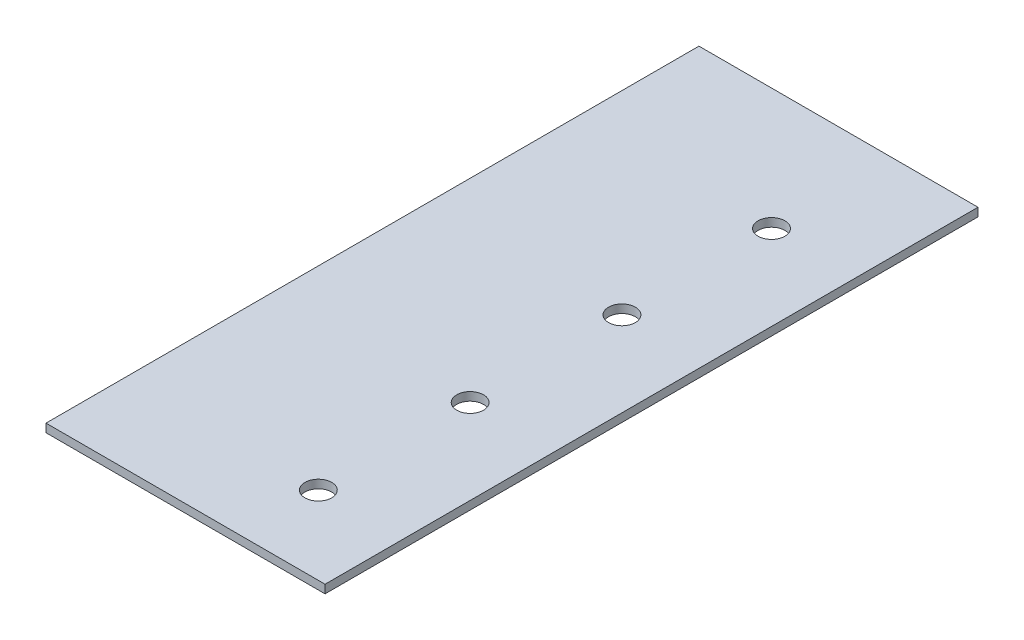
ISO-10303-21;
HEADER;
FILE_DESCRIPTION(('STEP AP214'),'2;1');
FILE_NAME('part.step','',(''),(''),'','','');
FILE_SCHEMA(('AUTOMOTIVE_DESIGN { 1 0 10303 214 1 1 1 1 }'));
ENDSEC;
DATA;
#1=APPLICATION_CONTEXT('core data for automotive mechanical design processes');
#2=APPLICATION_PROTOCOL_DEFINITION('international standard','automotive_design',2000,#1);
#3=PRODUCT_CONTEXT('',#1,'mechanical');
#4=PRODUCT('Part','Part','',(#3));
#5=PRODUCT_RELATED_PRODUCT_CATEGORY('part','',(#4));
#6=PRODUCT_DEFINITION_FORMATION('','',#4);
#7=PRODUCT_DEFINITION_CONTEXT('part definition',#1,'design');
#8=PRODUCT_DEFINITION('design','',#6,#7);
#9=PRODUCT_DEFINITION_SHAPE('','',#8);
#10=(LENGTH_UNIT() NAMED_UNIT(*) SI_UNIT(.MILLI.,.METRE.));
#11=(NAMED_UNIT(*) PLANE_ANGLE_UNIT() SI_UNIT($,.RADIAN.));
#12=(NAMED_UNIT(*) SI_UNIT($,.STERADIAN.) SOLID_ANGLE_UNIT());
#13=UNCERTAINTY_MEASURE_WITH_UNIT(LENGTH_MEASURE(1.E-05),#10,'distance_accuracy_value','');
#14=(GEOMETRIC_REPRESENTATION_CONTEXT(3) GLOBAL_UNCERTAINTY_ASSIGNED_CONTEXT((#13)) GLOBAL_UNIT_ASSIGNED_CONTEXT((#10,
#11,#12)) REPRESENTATION_CONTEXT('',''));
#15=CARTESIAN_POINT('',(0.,0.,0.));
#16=DIRECTION('',(0.,0.,1.));
#17=DIRECTION('',(1.,0.,0.));
#18=AXIS2_PLACEMENT_3D('',#15,#16,#17);
#19=CARTESIAN_POINT('',(0.,1.905,0.));
#20=DIRECTION('',(1.,0.,0.));
#21=DIRECTION('',(0.,0.,-1.));
#22=AXIS2_PLACEMENT_3D('',#19,#20,#21);
#23=PLANE('',#22);
#24=DIRECTION('',(0.,0.,1.));
#25=VECTOR('',#24,1.);
#26=CARTESIAN_POINT('',(0.,0.,0.));
#27=LINE('',#26,#25);
#28=CARTESIAN_POINT('',(0.,0.,-148.59));
#29=VERTEX_POINT('',#28);
#30=CARTESIAN_POINT('',(0.,0.,0.));
#31=VERTEX_POINT('',#30);
#32=EDGE_CURVE('E110',#29,#31,#27,.T.);
#33=ORIENTED_EDGE('',*,*,#32,.T.);
#34=DIRECTION('',(0.,-1.,0.));
#35=VECTOR('',#34,1.);
#36=CARTESIAN_POINT('',(0.,1.905,0.));
#37=LINE('',#36,#35);
#38=CARTESIAN_POINT('',(0.,1.905,0.));
#39=VERTEX_POINT('',#38);
#40=EDGE_CURVE('E11',#39,#31,#37,.T.);
#41=ORIENTED_EDGE('',*,*,#40,.F.);
#42=DIRECTION('',(0.,0.,1.));
#43=VECTOR('',#42,1.);
#44=CARTESIAN_POINT('',(0.,1.905,0.));
#45=LINE('',#44,#43);
#46=CARTESIAN_POINT('',(0.,1.905,-148.59));
#47=VERTEX_POINT('',#46);
#48=EDGE_CURVE('E94',#47,#39,#45,.T.);
#49=ORIENTED_EDGE('',*,*,#48,.F.);
#50=DIRECTION('',(0.,-1.,0.));
#51=VECTOR('',#50,1.);
#52=CARTESIAN_POINT('',(0.,1.905,-148.59));
#53=LINE('',#52,#51);
#54=EDGE_CURVE('E106',#47,#29,#53,.T.);
#55=ORIENTED_EDGE('',*,*,#54,.T.);
#56=EDGE_LOOP('',(#33,#41,#49,#55));
#57=FACE_BOUND('',#56,.T.);
#58=ADVANCED_FACE('F42',(#57),#23,.F.);
#59=CARTESIAN_POINT('',(0.,1.905,0.));
#60=DIRECTION('',(0.,0.,-1.));
#61=DIRECTION('',(-1.,0.,0.));
#62=AXIS2_PLACEMENT_3D('',#59,#60,#61);
#63=PLANE('',#62);
#64=DIRECTION('',(1.,0.,0.));
#65=VECTOR('',#64,1.);
#66=CARTESIAN_POINT('',(0.,0.,0.));
#67=LINE('',#66,#65);
#68=CARTESIAN_POINT('',(63.5,0.,0.));
#69=VERTEX_POINT('',#68);
#70=EDGE_CURVE('E99',#31,#69,#67,.T.);
#71=ORIENTED_EDGE('',*,*,#70,.T.);
#72=DIRECTION('',(0.,-1.,0.));
#73=VECTOR('',#72,1.);
#74=CARTESIAN_POINT('',(63.5,1.905,0.));
#75=LINE('',#74,#73);
#76=CARTESIAN_POINT('',(63.5,1.905,0.));
#77=VERTEX_POINT('',#76);
#78=EDGE_CURVE('E51',#77,#69,#75,.T.);
#79=ORIENTED_EDGE('',*,*,#78,.F.);
#80=DIRECTION('',(1.,0.,0.));
#81=VECTOR('',#80,1.);
#82=CARTESIAN_POINT('',(0.,1.905,0.));
#83=LINE('',#82,#81);
#84=EDGE_CURVE('E89',#39,#77,#83,.T.);
#85=ORIENTED_EDGE('',*,*,#84,.F.);
#86=ORIENTED_EDGE('',*,*,#40,.T.);
#87=EDGE_LOOP('',(#71,#79,#85,#86));
#88=FACE_BOUND('',#87,.T.);
#89=ADVANCED_FACE('F98',(#88),#63,.F.);
#90=CARTESIAN_POINT('',(63.5,1.905,0.));
#91=DIRECTION('',(-1.,0.,0.));
#92=DIRECTION('',(0.,0.,1.));
#93=AXIS2_PLACEMENT_3D('',#90,#91,#92);
#94=PLANE('',#93);
#95=DIRECTION('',(0.,0.,-1.));
#96=VECTOR('',#95,1.);
#97=CARTESIAN_POINT('',(63.5,0.,0.));
#98=LINE('',#97,#96);
#99=CARTESIAN_POINT('',(63.5,0.,-148.59));
#100=VERTEX_POINT('',#99);
#101=EDGE_CURVE('E76',#69,#100,#98,.T.);
#102=ORIENTED_EDGE('',*,*,#101,.T.);
#103=DIRECTION('',(0.,-1.,0.));
#104=VECTOR('',#103,1.);
#105=CARTESIAN_POINT('',(63.5,1.905,-148.59));
#106=LINE('',#105,#104);
#107=CARTESIAN_POINT('',(63.5,1.905,-148.59));
#108=VERTEX_POINT('',#107);
#109=EDGE_CURVE('E101',#108,#100,#106,.T.);
#110=ORIENTED_EDGE('',*,*,#109,.F.);
#111=DIRECTION('',(0.,0.,-1.));
#112=VECTOR('',#111,1.);
#113=CARTESIAN_POINT('',(63.5,1.905,0.));
#114=LINE('',#113,#112);
#115=EDGE_CURVE('E92',#77,#108,#114,.T.);
#116=ORIENTED_EDGE('',*,*,#115,.F.);
#117=ORIENTED_EDGE('',*,*,#78,.T.);
#118=EDGE_LOOP('',(#102,#110,#116,#117));
#119=FACE_BOUND('',#118,.T.);
#120=ADVANCED_FACE('F102',(#119),#94,.F.);
#121=CARTESIAN_POINT('',(0.,1.905,-148.59));
#122=DIRECTION('',(0.,0.,1.));
#123=DIRECTION('',(1.,0.,0.));
#124=AXIS2_PLACEMENT_3D('',#121,#122,#123);
#125=PLANE('',#124);
#126=DIRECTION('',(-1.,0.,0.));
#127=VECTOR('',#126,1.);
#128=CARTESIAN_POINT('',(0.,0.,-148.59));
#129=LINE('',#128,#127);
#130=EDGE_CURVE('E82',#100,#29,#129,.T.);
#131=ORIENTED_EDGE('',*,*,#130,.T.);
#132=ORIENTED_EDGE('',*,*,#54,.F.);
#133=DIRECTION('',(-1.,0.,0.));
#134=VECTOR('',#133,1.);
#135=CARTESIAN_POINT('',(0.,1.905,-148.59));
#136=LINE('',#135,#134);
#137=EDGE_CURVE('E59',#108,#47,#136,.T.);
#138=ORIENTED_EDGE('',*,*,#137,.F.);
#139=ORIENTED_EDGE('',*,*,#109,.T.);
#140=EDGE_LOOP('',(#131,#132,#138,#139));
#141=FACE_BOUND('',#140,.T.);
#142=ADVANCED_FACE('F124',(#141),#125,.F.);
#143=CARTESIAN_POINT('',(0.,1.905,0.));
#144=DIRECTION('',(0.,-1.,0.));
#145=DIRECTION('',(0.,0.,-1.));
#146=AXIS2_PLACEMENT_3D('',#143,#144,#145);
#147=PLANE('',#146);
#148=CARTESIAN_POINT('',(44.196,1.905,-120.904));
#149=DIRECTION('',(0.,-1.,0.));
#150=DIRECTION('',(0.,0.,-1.));
#151=AXIS2_PLACEMENT_3D('',#148,#149,#150);
#152=CIRCLE('',#151,3.048);
#153=CARTESIAN_POINT('',(44.196,1.905,-123.952));
#154=VERTEX_POINT('',#153);
#155=EDGE_CURVE('E114',#154,#154,#152,.T.);
#156=ORIENTED_EDGE('',*,*,#155,.T.);
#157=EDGE_LOOP('',(#156));
#158=FACE_BOUND('',#157,.T.);
#159=CARTESIAN_POINT('',(44.196,1.905,-86.868));
#160=DIRECTION('',(0.,-1.,0.));
#161=DIRECTION('',(0.,0.,-1.));
#162=AXIS2_PLACEMENT_3D('',#159,#160,#161);
#163=CIRCLE('',#162,3.048);
#164=CARTESIAN_POINT('',(44.196,1.905,-89.916));
#165=VERTEX_POINT('',#164);
#166=EDGE_CURVE('E134',#165,#165,#163,.T.);
#167=ORIENTED_EDGE('',*,*,#166,.T.);
#168=EDGE_LOOP('',(#167));
#169=FACE_BOUND('',#168,.T.);
#170=CARTESIAN_POINT('',(44.196,1.905,-52.324));
#171=DIRECTION('',(0.,-1.,0.));
#172=DIRECTION('',(0.,0.,-1.));
#173=AXIS2_PLACEMENT_3D('',#170,#171,#172);
#174=CIRCLE('',#173,3.048);
#175=CARTESIAN_POINT('',(44.196,1.905,-55.372));
#176=VERTEX_POINT('',#175);
#177=EDGE_CURVE('E138',#176,#176,#174,.T.);
#178=ORIENTED_EDGE('',*,*,#177,.T.);
#179=EDGE_LOOP('',(#178));
#180=FACE_BOUND('',#179,.T.);
#181=CARTESIAN_POINT('',(44.196,1.905,-17.78));
#182=DIRECTION('',(0.,-1.,0.));
#183=DIRECTION('',(0.,0.,-1.));
#184=AXIS2_PLACEMENT_3D('',#181,#182,#183);
#185=CIRCLE('',#184,3.048);
#186=CARTESIAN_POINT('',(44.196,1.905,-20.828));
#187=VERTEX_POINT('',#186);
#188=EDGE_CURVE('E142',#187,#187,#185,.T.);
#189=ORIENTED_EDGE('',*,*,#188,.T.);
#190=EDGE_LOOP('',(#189));
#191=FACE_BOUND('',#190,.T.);
#192=ORIENTED_EDGE('',*,*,#48,.T.);
#193=ORIENTED_EDGE('',*,*,#84,.T.);
#194=ORIENTED_EDGE('',*,*,#115,.T.);
#195=ORIENTED_EDGE('',*,*,#137,.T.);
#196=EDGE_LOOP('',(#192,#193,#194,#195));
#197=FACE_BOUND('',#196,.T.);
#198=ADVANCED_FACE('F90',(#158,#169,#180,#191,#197),#147,.F.);
#199=CARTESIAN_POINT('',(0.,0.,0.));
#200=DIRECTION('',(0.,-1.,0.));
#201=DIRECTION('',(0.,0.,-1.));
#202=AXIS2_PLACEMENT_3D('',#199,#200,#201);
#203=PLANE('',#202);
#204=CARTESIAN_POINT('',(44.196,0.,-120.904));
#205=DIRECTION('',(0.,-1.,0.));
#206=DIRECTION('',(0.,0.,-1.));
#207=AXIS2_PLACEMENT_3D('',#204,#205,#206);
#208=CIRCLE('',#207,3.048);
#209=CARTESIAN_POINT('',(44.196,0.,-123.952));
#210=VERTEX_POINT('',#209);
#211=EDGE_CURVE('E146',#210,#210,#208,.T.);
#212=ORIENTED_EDGE('',*,*,#211,.F.);
#213=EDGE_LOOP('',(#212));
#214=FACE_BOUND('',#213,.T.);
#215=CARTESIAN_POINT('',(44.196,0.,-86.868));
#216=DIRECTION('',(0.,-1.,0.));
#217=DIRECTION('',(0.,0.,-1.));
#218=AXIS2_PLACEMENT_3D('',#215,#216,#217);
#219=CIRCLE('',#218,3.048);
#220=CARTESIAN_POINT('',(44.196,0.,-89.916));
#221=VERTEX_POINT('',#220);
#222=EDGE_CURVE('E155',#221,#221,#219,.T.);
#223=ORIENTED_EDGE('',*,*,#222,.F.);
#224=EDGE_LOOP('',(#223));
#225=FACE_BOUND('',#224,.T.);
#226=CARTESIAN_POINT('',(44.196,0.,-52.324));
#227=DIRECTION('',(0.,-1.,0.));
#228=DIRECTION('',(0.,0.,-1.));
#229=AXIS2_PLACEMENT_3D('',#226,#227,#228);
#230=CIRCLE('',#229,3.048);
#231=CARTESIAN_POINT('',(44.196,0.,-55.372));
#232=VERTEX_POINT('',#231);
#233=EDGE_CURVE('E151',#232,#232,#230,.T.);
#234=ORIENTED_EDGE('',*,*,#233,.F.);
#235=EDGE_LOOP('',(#234));
#236=FACE_BOUND('',#235,.T.);
#237=CARTESIAN_POINT('',(44.196,0.,-17.78));
#238=DIRECTION('',(0.,-1.,0.));
#239=DIRECTION('',(0.,0.,-1.));
#240=AXIS2_PLACEMENT_3D('',#237,#238,#239);
#241=CIRCLE('',#240,3.048);
#242=CARTESIAN_POINT('',(44.196,0.,-20.828));
#243=VERTEX_POINT('',#242);
#244=EDGE_CURVE('E147',#243,#243,#241,.T.);
#245=ORIENTED_EDGE('',*,*,#244,.F.);
#246=EDGE_LOOP('',(#245));
#247=FACE_BOUND('',#246,.T.);
#248=ORIENTED_EDGE('',*,*,#32,.F.);
#249=ORIENTED_EDGE('',*,*,#130,.F.);
#250=ORIENTED_EDGE('',*,*,#101,.F.);
#251=ORIENTED_EDGE('',*,*,#70,.F.);
#252=EDGE_LOOP('',(#248,#249,#250,#251));
#253=FACE_BOUND('',#252,.T.);
#254=ADVANCED_FACE('F127',(#214,#225,#236,#247,#253),#203,.T.);
#255=CARTESIAN_POINT('',(44.196,2.54,-17.78));
#256=DIRECTION('',(0.,-1.,0.));
#257=DIRECTION('',(0.,0.,-1.));
#258=AXIS2_PLACEMENT_3D('',#255,#256,#257);
#259=CYLINDRICAL_SURFACE('',#258,3.048);
#260=ORIENTED_EDGE('',*,*,#244,.T.);
#261=EDGE_LOOP('',(#260));
#262=FACE_BOUND('',#261,.T.);
#263=ORIENTED_EDGE('',*,*,#188,.F.);
#264=EDGE_LOOP('',(#263));
#265=FACE_BOUND('',#264,.T.);
#266=ADVANCED_FACE('F168',(#262,#265),#259,.F.);
#267=CARTESIAN_POINT('',(44.196,2.54,-52.324));
#268=DIRECTION('',(0.,-1.,0.));
#269=DIRECTION('',(0.,0.,-1.));
#270=AXIS2_PLACEMENT_3D('',#267,#268,#269);
#271=CYLINDRICAL_SURFACE('',#270,3.048);
#272=ORIENTED_EDGE('',*,*,#233,.T.);
#273=EDGE_LOOP('',(#272));
#274=FACE_BOUND('',#273,.T.);
#275=ORIENTED_EDGE('',*,*,#177,.F.);
#276=EDGE_LOOP('',(#275));
#277=FACE_BOUND('',#276,.T.);
#278=ADVANCED_FACE('F178',(#274,#277),#271,.F.);
#279=CARTESIAN_POINT('',(44.196,2.54,-86.868));
#280=DIRECTION('',(0.,-1.,0.));
#281=DIRECTION('',(0.,0.,-1.));
#282=AXIS2_PLACEMENT_3D('',#279,#280,#281);
#283=CYLINDRICAL_SURFACE('',#282,3.048);
#284=ORIENTED_EDGE('',*,*,#222,.T.);
#285=EDGE_LOOP('',(#284));
#286=FACE_BOUND('',#285,.T.);
#287=ORIENTED_EDGE('',*,*,#166,.F.);
#288=EDGE_LOOP('',(#287));
#289=FACE_BOUND('',#288,.T.);
#290=ADVANCED_FACE('F226',(#286,#289),#283,.F.);
#291=CARTESIAN_POINT('',(44.196,2.54,-120.904));
#292=DIRECTION('',(0.,-1.,0.));
#293=DIRECTION('',(0.,0.,-1.));
#294=AXIS2_PLACEMENT_3D('',#291,#292,#293);
#295=CYLINDRICAL_SURFACE('',#294,3.048);
#296=ORIENTED_EDGE('',*,*,#211,.T.);
#297=EDGE_LOOP('',(#296));
#298=FACE_BOUND('',#297,.T.);
#299=ORIENTED_EDGE('',*,*,#155,.F.);
#300=EDGE_LOOP('',(#299));
#301=FACE_BOUND('',#300,.T.);
#302=ADVANCED_FACE('F163',(#298,#301),#295,.F.);
#303=CLOSED_SHELL('',(#58,#89,#120,#142,#198,#254,#266,#278,#290,#302));
#304=MANIFOLD_SOLID_BREP('B2',#303);
#305=ADVANCED_BREP_SHAPE_REPRESENTATION('',(#18,#304),#14);
#306=SHAPE_DEFINITION_REPRESENTATION(#9,#305);
ENDSEC;
END-ISO-10303-21;
